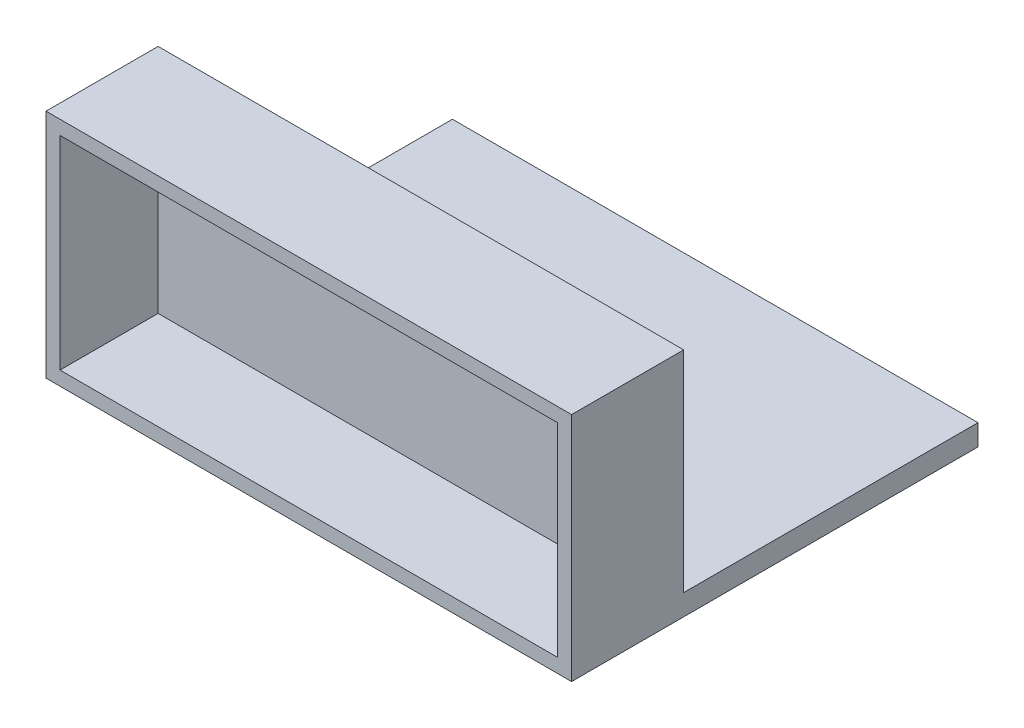
ISO-10303-21;
HEADER;
FILE_DESCRIPTION(('STEP AP214'),'2;1');
FILE_NAME('part.step','',(''),(''),'','','');
FILE_SCHEMA(('AUTOMOTIVE_DESIGN { 1 0 10303 214 1 1 1 1 }'));
ENDSEC;
DATA;
#1=APPLICATION_CONTEXT('core data for automotive mechanical design processes');
#2=APPLICATION_PROTOCOL_DEFINITION('international standard','automotive_design',2000,#1);
#3=PRODUCT_CONTEXT('',#1,'mechanical');
#4=PRODUCT('Part','Part','',(#3));
#5=PRODUCT_RELATED_PRODUCT_CATEGORY('part','',(#4));
#6=PRODUCT_DEFINITION_FORMATION('','',#4);
#7=PRODUCT_DEFINITION_CONTEXT('part definition',#1,'design');
#8=PRODUCT_DEFINITION('design','',#6,#7);
#9=PRODUCT_DEFINITION_SHAPE('','',#8);
#10=(LENGTH_UNIT() NAMED_UNIT(*) SI_UNIT(.MILLI.,.METRE.));
#11=(NAMED_UNIT(*) PLANE_ANGLE_UNIT() SI_UNIT($,.RADIAN.));
#12=(NAMED_UNIT(*) SI_UNIT($,.STERADIAN.) SOLID_ANGLE_UNIT());
#13=UNCERTAINTY_MEASURE_WITH_UNIT(LENGTH_MEASURE(1.E-05),#10,'distance_accuracy_value','');
#14=(GEOMETRIC_REPRESENTATION_CONTEXT(3) GLOBAL_UNCERTAINTY_ASSIGNED_CONTEXT((#13)) GLOBAL_UNIT_ASSIGNED_CONTEXT((#10,
#11,#12)) REPRESENTATION_CONTEXT('',''));
#15=CARTESIAN_POINT('',(0.,0.,0.));
#16=DIRECTION('',(0.,0.,1.));
#17=DIRECTION('',(1.,0.,0.));
#18=AXIS2_PLACEMENT_3D('',#15,#16,#17);
#19=CARTESIAN_POINT('',(0.,0.,0.));
#20=DIRECTION('',(0.,1.,0.));
#21=DIRECTION('',(0.,0.,1.));
#22=AXIS2_PLACEMENT_3D('',#19,#20,#21);
#23=PLANE('',#22);
#24=DIRECTION('',(1.,0.,0.));
#25=VECTOR('',#24,1.);
#26=CARTESIAN_POINT('',(-75.,0.,66.));
#27=LINE('',#26,#25);
#28=CARTESIAN_POINT('',(-75.,0.,66.));
#29=VERTEX_POINT('',#28);
#30=CARTESIAN_POINT('',(75.,0.,66.));
#31=VERTEX_POINT('',#30);
#32=EDGE_CURVE('E173',#29,#31,#27,.T.);
#33=ORIENTED_EDGE('',*,*,#32,.F.);
#34=DIRECTION('',(0.,0.,1.));
#35=VECTOR('',#34,1.);
#36=CARTESIAN_POINT('',(-75.,0.,-50.));
#37=LINE('',#36,#35);
#38=CARTESIAN_POINT('',(-75.,0.,-50.));
#39=VERTEX_POINT('',#38);
#40=EDGE_CURVE('E175',#39,#29,#37,.T.);
#41=ORIENTED_EDGE('',*,*,#40,.F.);
#42=DIRECTION('',(-1.,0.,0.));
#43=VECTOR('',#42,1.);
#44=CARTESIAN_POINT('',(-75.,0.,-50.));
#45=LINE('',#44,#43);
#46=CARTESIAN_POINT('',(75.,0.,-50.));
#47=VERTEX_POINT('',#46);
#48=EDGE_CURVE('E179',#47,#39,#45,.T.);
#49=ORIENTED_EDGE('',*,*,#48,.F.);
#50=DIRECTION('',(0.,0.,-1.));
#51=VECTOR('',#50,1.);
#52=CARTESIAN_POINT('',(75.,0.,-50.));
#53=LINE('',#52,#51);
#54=EDGE_CURVE('E185',#31,#47,#53,.T.);
#55=ORIENTED_EDGE('',*,*,#54,.F.);
#56=EDGE_LOOP('',(#33,#41,#49,#55));
#57=FACE_BOUND('',#56,.T.);
#58=ADVANCED_FACE('F37',(#57),#23,.F.);
#59=CARTESIAN_POINT('',(-75.,6.,-50.));
#60=DIRECTION('',(1.,0.,0.));
#61=DIRECTION('',(0.,0.,-1.));
#62=AXIS2_PLACEMENT_3D('',#59,#60,#61);
#63=PLANE('',#62);
#64=ORIENTED_EDGE('',*,*,#40,.T.);
#65=DIRECTION('',(0.,-1.,0.));
#66=VECTOR('',#65,1.);
#67=CARTESIAN_POINT('',(-75.,66.,66.));
#68=LINE('',#67,#66);
#69=CARTESIAN_POINT('',(-75.,66.,66.));
#70=VERTEX_POINT('',#69);
#71=EDGE_CURVE('E149',#70,#29,#68,.T.);
#72=ORIENTED_EDGE('',*,*,#71,.F.);
#73=DIRECTION('',(0.,0.,1.));
#74=VECTOR('',#73,1.);
#75=CARTESIAN_POINT('',(-75.,66.,70.));
#76=LINE('',#75,#74);
#77=CARTESIAN_POINT('',(-75.,66.,34.));
#78=VERTEX_POINT('',#77);
#79=EDGE_CURVE('E158',#78,#70,#76,.T.);
#80=ORIENTED_EDGE('',*,*,#79,.F.);
#81=DIRECTION('',(0.,-1.,0.));
#82=VECTOR('',#81,1.);
#83=CARTESIAN_POINT('',(-75.,66.,34.));
#84=LINE('',#83,#82);
#85=CARTESIAN_POINT('',(-75.,6.,34.));
#86=VERTEX_POINT('',#85);
#87=EDGE_CURVE('E165',#78,#86,#84,.T.);
#88=ORIENTED_EDGE('',*,*,#87,.T.);
#89=DIRECTION('',(0.,0.,1.));
#90=VECTOR('',#89,1.);
#91=CARTESIAN_POINT('',(-75.,6.,-50.));
#92=LINE('',#91,#90);
#93=CARTESIAN_POINT('',(-75.,6.,-50.));
#94=VERTEX_POINT('',#93);
#95=EDGE_CURVE('E176',#94,#86,#92,.T.);
#96=ORIENTED_EDGE('',*,*,#95,.F.);
#97=DIRECTION('',(0.,-1.,0.));
#98=VECTOR('',#97,1.);
#99=CARTESIAN_POINT('',(-75.,6.,-50.));
#100=LINE('',#99,#98);
#101=EDGE_CURVE('E45',#94,#39,#100,.T.);
#102=ORIENTED_EDGE('',*,*,#101,.T.);
#103=EDGE_LOOP('',(#64,#72,#80,#88,#96,#102));
#104=FACE_BOUND('',#103,.T.);
#105=ADVANCED_FACE('F39',(#104),#63,.F.);
#106=CARTESIAN_POINT('',(75.,6.,-50.));
#107=DIRECTION('',(-1.,0.,0.));
#108=DIRECTION('',(0.,0.,1.));
#109=AXIS2_PLACEMENT_3D('',#106,#107,#108);
#110=PLANE('',#109);
#111=DIRECTION('',(0.,0.,-1.));
#112=VECTOR('',#111,1.);
#113=CARTESIAN_POINT('',(75.,66.,70.));
#114=LINE('',#113,#112);
#115=CARTESIAN_POINT('',(75.,66.,66.));
#116=VERTEX_POINT('',#115);
#117=CARTESIAN_POINT('',(75.,66.,34.));
#118=VERTEX_POINT('',#117);
#119=EDGE_CURVE('E161',#116,#118,#114,.T.);
#120=ORIENTED_EDGE('',*,*,#119,.F.);
#121=DIRECTION('',(0.,1.,0.));
#122=VECTOR('',#121,1.);
#123=CARTESIAN_POINT('',(75.,-7.99999999999992,66.));
#124=LINE('',#123,#122);
#125=EDGE_CURVE('E60',#31,#116,#124,.T.);
#126=ORIENTED_EDGE('',*,*,#125,.F.);
#127=ORIENTED_EDGE('',*,*,#54,.T.);
#128=DIRECTION('',(0.,-1.,0.));
#129=VECTOR('',#128,1.);
#130=CARTESIAN_POINT('',(75.,6.,-50.));
#131=LINE('',#130,#129);
#132=CARTESIAN_POINT('',(75.,6.,-50.));
#133=VERTEX_POINT('',#132);
#134=EDGE_CURVE('E11',#133,#47,#131,.T.);
#135=ORIENTED_EDGE('',*,*,#134,.F.);
#136=DIRECTION('',(0.,0.,-1.));
#137=VECTOR('',#136,1.);
#138=CARTESIAN_POINT('',(75.,6.,-50.));
#139=LINE('',#138,#137);
#140=CARTESIAN_POINT('',(75.,6.,34.));
#141=VERTEX_POINT('',#140);
#142=EDGE_CURVE('E178',#141,#133,#139,.T.);
#143=ORIENTED_EDGE('',*,*,#142,.F.);
#144=DIRECTION('',(0.,-1.,0.));
#145=VECTOR('',#144,1.);
#146=CARTESIAN_POINT('',(75.,66.,34.));
#147=LINE('',#146,#145);
#148=EDGE_CURVE('E170',#118,#141,#147,.T.);
#149=ORIENTED_EDGE('',*,*,#148,.F.);
#150=EDGE_LOOP('',(#120,#126,#127,#135,#143,#149));
#151=FACE_BOUND('',#150,.T.);
#152=ADVANCED_FACE('F202',(#151),#110,.F.);
#153=CARTESIAN_POINT('',(-75.,6.,-50.));
#154=DIRECTION('',(0.,0.,1.));
#155=DIRECTION('',(1.,0.,0.));
#156=AXIS2_PLACEMENT_3D('',#153,#154,#155);
#157=PLANE('',#156);
#158=ORIENTED_EDGE('',*,*,#48,.T.);
#159=ORIENTED_EDGE('',*,*,#101,.F.);
#160=DIRECTION('',(-1.,0.,0.));
#161=VECTOR('',#160,1.);
#162=CARTESIAN_POINT('',(-75.,6.,-50.));
#163=LINE('',#162,#161);
#164=EDGE_CURVE('E181',#133,#94,#163,.T.);
#165=ORIENTED_EDGE('',*,*,#164,.F.);
#166=ORIENTED_EDGE('',*,*,#134,.T.);
#167=EDGE_LOOP('',(#158,#159,#165,#166));
#168=FACE_BOUND('',#167,.T.);
#169=ADVANCED_FACE('F215',(#168),#157,.F.);
#170=CARTESIAN_POINT('',(0.,6.,0.));
#171=DIRECTION('',(0.,1.,0.));
#172=DIRECTION('',(0.,0.,1.));
#173=AXIS2_PLACEMENT_3D('',#170,#171,#172);
#174=PLANE('',#173);
#175=DIRECTION('',(-1.,0.,0.));
#176=VECTOR('',#175,1.);
#177=CARTESIAN_POINT('',(-75.,6.,34.));
#178=LINE('',#177,#176);
#179=EDGE_CURVE('E156',#141,#86,#178,.T.);
#180=ORIENTED_EDGE('',*,*,#179,.F.);
#181=ORIENTED_EDGE('',*,*,#142,.T.);
#182=ORIENTED_EDGE('',*,*,#164,.T.);
#183=ORIENTED_EDGE('',*,*,#95,.T.);
#184=EDGE_LOOP('',(#180,#181,#182,#183));
#185=FACE_BOUND('',#184,.T.);
#186=ADVANCED_FACE('F214',(#185),#174,.T.);
#187=CARTESIAN_POINT('',(-75.,66.,34.));
#188=DIRECTION('',(0.,0.,1.));
#189=DIRECTION('',(1.,0.,0.));
#190=AXIS2_PLACEMENT_3D('',#187,#188,#189);
#191=PLANE('',#190);
#192=ORIENTED_EDGE('',*,*,#179,.T.);
#193=ORIENTED_EDGE('',*,*,#87,.F.);
#194=DIRECTION('',(-1.,0.,0.));
#195=VECTOR('',#194,1.);
#196=CARTESIAN_POINT('',(-75.,66.,34.));
#197=LINE('',#196,#195);
#198=EDGE_CURVE('E163',#118,#78,#197,.T.);
#199=ORIENTED_EDGE('',*,*,#198,.F.);
#200=ORIENTED_EDGE('',*,*,#148,.T.);
#201=EDGE_LOOP('',(#192,#193,#199,#200));
#202=FACE_BOUND('',#201,.T.);
#203=ADVANCED_FACE('F212',(#202),#191,.F.);
#204=CARTESIAN_POINT('',(0.,66.,0.));
#205=DIRECTION('',(0.,-1.,0.));
#206=DIRECTION('',(0.,0.,-1.));
#207=AXIS2_PLACEMENT_3D('',#204,#205,#206);
#208=PLANE('',#207);
#209=ORIENTED_EDGE('',*,*,#79,.T.);
#210=DIRECTION('',(-1.,0.,0.));
#211=VECTOR('',#210,1.);
#212=CARTESIAN_POINT('',(75.,66.,66.));
#213=LINE('',#212,#211);
#214=EDGE_CURVE('E154',#116,#70,#213,.T.);
#215=ORIENTED_EDGE('',*,*,#214,.F.);
#216=ORIENTED_EDGE('',*,*,#119,.T.);
#217=ORIENTED_EDGE('',*,*,#198,.T.);
#218=EDGE_LOOP('',(#209,#215,#216,#217));
#219=FACE_BOUND('',#218,.T.);
#220=ADVANCED_FACE('F208',(#219),#208,.F.);
#221=CARTESIAN_POINT('',(-99.9999999999999,-35.9999999999999,66.));
#222=DIRECTION('',(0.,0.,-1.));
#223=DIRECTION('',(-1.,0.,0.));
#224=AXIS2_PLACEMENT_3D('',#221,#222,#223);
#225=PLANE('',#224);
#226=DIRECTION('',(1.,0.,0.));
#227=VECTOR('',#226,1.);
#228=CARTESIAN_POINT('',(-71.,3.99999999999998,66.));
#229=LINE('',#228,#227);
#230=CARTESIAN_POINT('',(-71.,3.99999999999998,66.));
#231=VERTEX_POINT('',#230);
#232=CARTESIAN_POINT('',(71.,3.99999999999998,66.));
#233=VERTEX_POINT('',#232);
#234=EDGE_CURVE('E143',#231,#233,#229,.T.);
#235=ORIENTED_EDGE('',*,*,#234,.F.);
#236=DIRECTION('',(0.,-1.,0.));
#237=VECTOR('',#236,1.);
#238=CARTESIAN_POINT('',(-71.,62.,66.));
#239=LINE('',#238,#237);
#240=CARTESIAN_POINT('',(-71.,62.,66.));
#241=VERTEX_POINT('',#240);
#242=EDGE_CURVE('E52',#241,#231,#239,.T.);
#243=ORIENTED_EDGE('',*,*,#242,.F.);
#244=DIRECTION('',(-1.,0.,0.));
#245=VECTOR('',#244,1.);
#246=CARTESIAN_POINT('',(-71.,62.,66.));
#247=LINE('',#246,#245);
#248=CARTESIAN_POINT('',(71.,62.,66.));
#249=VERTEX_POINT('',#248);
#250=EDGE_CURVE('E134',#249,#241,#247,.T.);
#251=ORIENTED_EDGE('',*,*,#250,.F.);
#252=DIRECTION('',(0.,1.,0.));
#253=VECTOR('',#252,1.);
#254=CARTESIAN_POINT('',(71.,62.,66.));
#255=LINE('',#254,#253);
#256=EDGE_CURVE('E137',#233,#249,#255,.T.);
#257=ORIENTED_EDGE('',*,*,#256,.F.);
#258=EDGE_LOOP('',(#235,#243,#251,#257));
#259=FACE_BOUND('',#258,.T.);
#260=ORIENTED_EDGE('',*,*,#125,.T.);
#261=ORIENTED_EDGE('',*,*,#214,.T.);
#262=ORIENTED_EDGE('',*,*,#71,.T.);
#263=ORIENTED_EDGE('',*,*,#32,.T.);
#264=EDGE_LOOP('',(#260,#261,#262,#263));
#265=FACE_BOUND('',#264,.T.);
#266=ADVANCED_FACE('F199',(#259,#265),#225,.F.);
#267=CARTESIAN_POINT('',(-71.,62.,38.));
#268=DIRECTION('',(-1.,0.,0.));
#269=DIRECTION('',(0.,-1.,0.));
#270=AXIS2_PLACEMENT_3D('',#267,#268,#269);
#271=PLANE('',#270);
#272=ORIENTED_EDGE('',*,*,#242,.T.);
#273=DIRECTION('',(0.,0.,1.));
#274=VECTOR('',#273,1.);
#275=CARTESIAN_POINT('',(-71.,3.99999999999998,38.));
#276=LINE('',#275,#274);
#277=CARTESIAN_POINT('',(-71.,3.99999999999998,38.));
#278=VERTEX_POINT('',#277);
#279=EDGE_CURVE('E112',#278,#231,#276,.T.);
#280=ORIENTED_EDGE('',*,*,#279,.F.);
#281=DIRECTION('',(0.,-1.,0.));
#282=VECTOR('',#281,1.);
#283=CARTESIAN_POINT('',(-71.,62.,38.));
#284=LINE('',#283,#282);
#285=CARTESIAN_POINT('',(-71.,62.,38.));
#286=VERTEX_POINT('',#285);
#287=EDGE_CURVE('E116',#286,#278,#284,.T.);
#288=ORIENTED_EDGE('',*,*,#287,.F.);
#289=DIRECTION('',(0.,0.,1.));
#290=VECTOR('',#289,1.);
#291=CARTESIAN_POINT('',(-71.,62.,38.));
#292=LINE('',#291,#290);
#293=EDGE_CURVE('E147',#286,#241,#292,.T.);
#294=ORIENTED_EDGE('',*,*,#293,.T.);
#295=EDGE_LOOP('',(#272,#280,#288,#294));
#296=FACE_BOUND('',#295,.T.);
#297=ADVANCED_FACE('F114',(#296),#271,.F.);
#298=CARTESIAN_POINT('',(-71.,62.,38.));
#299=DIRECTION('',(0.,1.,0.));
#300=DIRECTION('',(0.,0.,1.));
#301=AXIS2_PLACEMENT_3D('',#298,#299,#300);
#302=PLANE('',#301);
#303=ORIENTED_EDGE('',*,*,#250,.T.);
#304=ORIENTED_EDGE('',*,*,#293,.F.);
#305=DIRECTION('',(-1.,0.,0.));
#306=VECTOR('',#305,1.);
#307=CARTESIAN_POINT('',(-71.,62.,38.));
#308=LINE('',#307,#306);
#309=CARTESIAN_POINT('',(71.,62.,38.));
#310=VERTEX_POINT('',#309);
#311=EDGE_CURVE('E122',#310,#286,#308,.T.);
#312=ORIENTED_EDGE('',*,*,#311,.F.);
#313=DIRECTION('',(0.,0.,1.));
#314=VECTOR('',#313,1.);
#315=CARTESIAN_POINT('',(71.,62.,38.));
#316=LINE('',#315,#314);
#317=EDGE_CURVE('E150',#310,#249,#316,.T.);
#318=ORIENTED_EDGE('',*,*,#317,.T.);
#319=EDGE_LOOP('',(#303,#304,#312,#318));
#320=FACE_BOUND('',#319,.T.);
#321=ADVANCED_FACE('F238',(#320),#302,.F.);
#322=CARTESIAN_POINT('',(71.,62.,38.));
#323=DIRECTION('',(1.,0.,0.));
#324=DIRECTION('',(0.,1.,0.));
#325=AXIS2_PLACEMENT_3D('',#322,#323,#324);
#326=PLANE('',#325);
#327=ORIENTED_EDGE('',*,*,#256,.T.);
#328=ORIENTED_EDGE('',*,*,#317,.F.);
#329=DIRECTION('',(0.,1.,0.));
#330=VECTOR('',#329,1.);
#331=CARTESIAN_POINT('',(71.,62.,38.));
#332=LINE('',#331,#330);
#333=CARTESIAN_POINT('',(71.,3.99999999999998,38.));
#334=VERTEX_POINT('',#333);
#335=EDGE_CURVE('E130',#334,#310,#332,.T.);
#336=ORIENTED_EDGE('',*,*,#335,.F.);
#337=DIRECTION('',(0.,0.,1.));
#338=VECTOR('',#337,1.);
#339=CARTESIAN_POINT('',(71.,3.99999999999998,38.));
#340=LINE('',#339,#338);
#341=EDGE_CURVE('E121',#334,#233,#340,.T.);
#342=ORIENTED_EDGE('',*,*,#341,.T.);
#343=EDGE_LOOP('',(#327,#328,#336,#342));
#344=FACE_BOUND('',#343,.T.);
#345=ADVANCED_FACE('F241',(#344),#326,.F.);
#346=CARTESIAN_POINT('',(-71.,3.99999999999998,38.));
#347=DIRECTION('',(0.,-1.,0.));
#348=DIRECTION('',(0.,0.,-1.));
#349=AXIS2_PLACEMENT_3D('',#346,#347,#348);
#350=PLANE('',#349);
#351=ORIENTED_EDGE('',*,*,#234,.T.);
#352=ORIENTED_EDGE('',*,*,#341,.F.);
#353=DIRECTION('',(1.,0.,0.));
#354=VECTOR('',#353,1.);
#355=CARTESIAN_POINT('',(-71.,3.99999999999998,38.));
#356=LINE('',#355,#354);
#357=EDGE_CURVE('E125',#278,#334,#356,.T.);
#358=ORIENTED_EDGE('',*,*,#357,.F.);
#359=ORIENTED_EDGE('',*,*,#279,.T.);
#360=EDGE_LOOP('',(#351,#352,#358,#359));
#361=FACE_BOUND('',#360,.T.);
#362=ADVANCED_FACE('F126',(#361),#350,.F.);
#363=CARTESIAN_POINT('',(0.,0.,38.));
#364=DIRECTION('',(0.,0.,1.));
#365=DIRECTION('',(1.,0.,0.));
#366=AXIS2_PLACEMENT_3D('',#363,#364,#365);
#367=PLANE('',#366);
#368=ORIENTED_EDGE('',*,*,#287,.T.);
#369=ORIENTED_EDGE('',*,*,#357,.T.);
#370=ORIENTED_EDGE('',*,*,#335,.T.);
#371=ORIENTED_EDGE('',*,*,#311,.T.);
#372=EDGE_LOOP('',(#368,#369,#370,#371));
#373=FACE_BOUND('',#372,.T.);
#374=ADVANCED_FACE('F132',(#373),#367,.T.);
#375=CLOSED_SHELL('',(#58,#105,#152,#169,#186,#203,#220,#266,#297,#321,#345,#362,#374));
#376=MANIFOLD_SOLID_BREP('B2',#375);
#377=ADVANCED_BREP_SHAPE_REPRESENTATION('',(#18,#376),#14);
#378=SHAPE_DEFINITION_REPRESENTATION(#9,#377);
ENDSEC;
END-ISO-10303-21;
